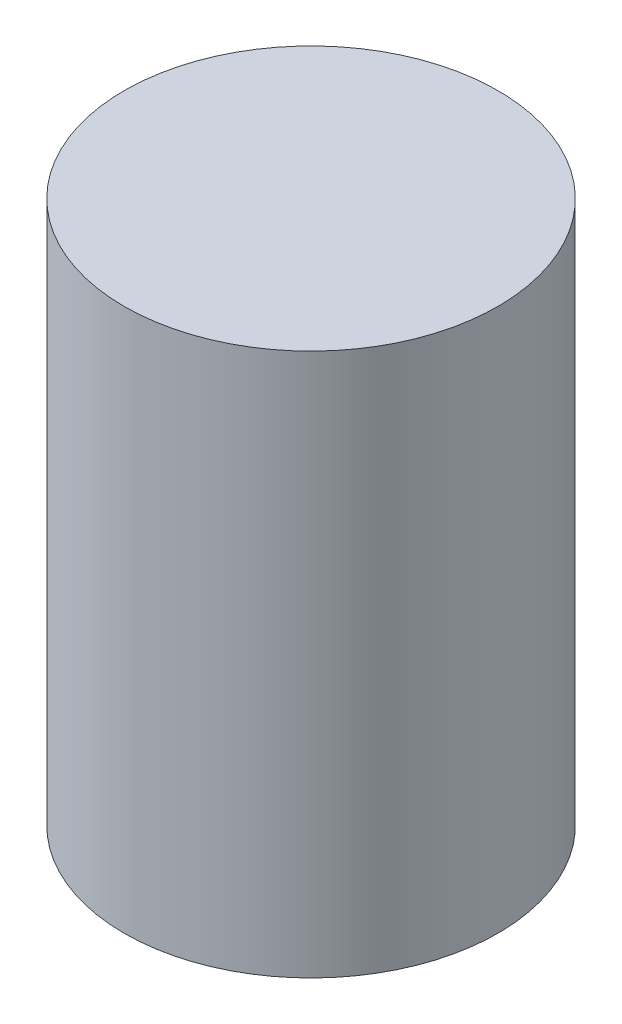
ISO-10303-21;
HEADER;
FILE_DESCRIPTION(('STEP AP214'),'2;1');
FILE_NAME('part.step','',(''),(''),'','','');
FILE_SCHEMA(('AUTOMOTIVE_DESIGN { 1 0 10303 214 1 1 1 1 }'));
ENDSEC;
DATA;
#1=APPLICATION_CONTEXT('core data for automotive mechanical design processes');
#2=APPLICATION_PROTOCOL_DEFINITION('international standard','automotive_design',2000,#1);
#3=PRODUCT_CONTEXT('',#1,'mechanical');
#4=PRODUCT('Part','Part','',(#3));
#5=PRODUCT_RELATED_PRODUCT_CATEGORY('part','',(#4));
#6=PRODUCT_DEFINITION_FORMATION('','',#4);
#7=PRODUCT_DEFINITION_CONTEXT('part definition',#1,'design');
#8=PRODUCT_DEFINITION('design','',#6,#7);
#9=PRODUCT_DEFINITION_SHAPE('','',#8);
#10=(LENGTH_UNIT() NAMED_UNIT(*) SI_UNIT(.MILLI.,.METRE.));
#11=(NAMED_UNIT(*) PLANE_ANGLE_UNIT() SI_UNIT($,.RADIAN.));
#12=(NAMED_UNIT(*) SI_UNIT($,.STERADIAN.) SOLID_ANGLE_UNIT());
#13=UNCERTAINTY_MEASURE_WITH_UNIT(LENGTH_MEASURE(1.E-05),#10,'distance_accuracy_value','');
#14=(GEOMETRIC_REPRESENTATION_CONTEXT(3) GLOBAL_UNCERTAINTY_ASSIGNED_CONTEXT((#13)) GLOBAL_UNIT_ASSIGNED_CONTEXT((#10,
#11,#12)) REPRESENTATION_CONTEXT('',''));
#15=CARTESIAN_POINT('',(0.,0.,0.));
#16=DIRECTION('',(0.,0.,1.));
#17=DIRECTION('',(1.,0.,0.));
#18=AXIS2_PLACEMENT_3D('',#15,#16,#17);
#19=CARTESIAN_POINT('',(0.,7.262,0.));
#20=DIRECTION('',(0.,-1.,0.));
#21=DIRECTION('',(0.,0.,-1.));
#22=AXIS2_PLACEMENT_3D('',#19,#20,#21);
#23=CYLINDRICAL_SURFACE('',#22,5.);
#24=CARTESIAN_POINT('',(0.,7.262,0.));
#25=DIRECTION('',(0.,1.,0.));
#26=DIRECTION('',(0.,0.,1.));
#27=AXIS2_PLACEMENT_3D('',#24,#25,#26);
#28=CIRCLE('',#27,5.);
#29=CARTESIAN_POINT('',(0.,7.262,5.));
#30=VERTEX_POINT('',#29);
#31=EDGE_CURVE('E10',#30,#30,#28,.T.);
#32=ORIENTED_EDGE('',*,*,#31,.F.);
#33=EDGE_LOOP('',(#32));
#34=FACE_BOUND('',#33,.T.);
#35=CARTESIAN_POINT('',(0.,-7.262,0.));
#36=DIRECTION('',(0.,1.,0.));
#37=DIRECTION('',(0.,0.,1.));
#38=AXIS2_PLACEMENT_3D('',#35,#36,#37);
#39=CIRCLE('',#38,5.);
#40=CARTESIAN_POINT('',(0.,-7.262,5.));
#41=VERTEX_POINT('',#40);
#42=EDGE_CURVE('E42',#41,#41,#39,.T.);
#43=ORIENTED_EDGE('',*,*,#42,.T.);
#44=EDGE_LOOP('',(#43));
#45=FACE_BOUND('',#44,.T.);
#46=ADVANCED_FACE('F41',(#34,#45),#23,.T.);
#47=CARTESIAN_POINT('',(0.,7.262,0.));
#48=DIRECTION('',(0.,1.,0.));
#49=DIRECTION('',(0.,0.,1.));
#50=AXIS2_PLACEMENT_3D('',#47,#48,#49);
#51=PLANE('',#50);
#52=ORIENTED_EDGE('',*,*,#31,.T.);
#53=EDGE_LOOP('',(#52));
#54=FACE_BOUND('',#53,.T.);
#55=ADVANCED_FACE('F59',(#54),#51,.T.);
#56=CARTESIAN_POINT('',(0.,-7.262,0.));
#57=DIRECTION('',(0.,1.,0.));
#58=DIRECTION('',(0.,0.,1.));
#59=AXIS2_PLACEMENT_3D('',#56,#57,#58);
#60=PLANE('',#59);
#61=ORIENTED_EDGE('',*,*,#42,.F.);
#62=EDGE_LOOP('',(#61));
#63=FACE_BOUND('',#62,.T.);
#64=ADVANCED_FACE('F57',(#63),#60,.F.);
#65=CLOSED_SHELL('',(#46,#55,#64));
#66=MANIFOLD_SOLID_BREP('B2',#65);
#67=ADVANCED_BREP_SHAPE_REPRESENTATION('',(#18,#66),#14);
#68=SHAPE_DEFINITION_REPRESENTATION(#9,#67);
ENDSEC;
END-ISO-10303-21;
